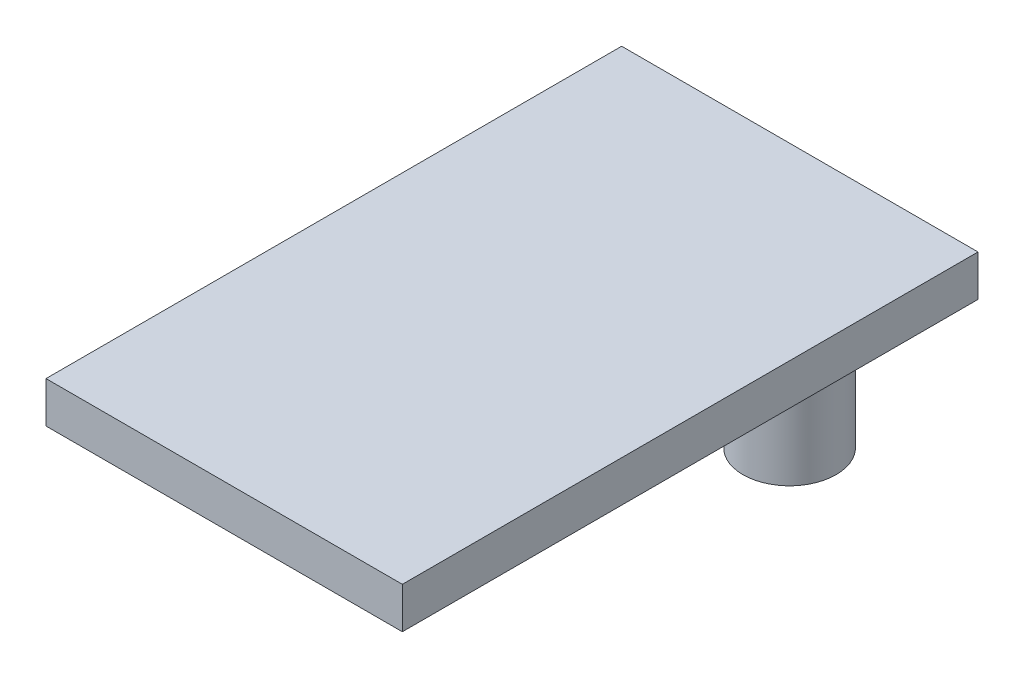
ISO-10303-21;
HEADER;
FILE_DESCRIPTION(('STEP AP214'),'2;1');
FILE_NAME('part.step','',(''),(''),'','','');
FILE_SCHEMA(('AUTOMOTIVE_DESIGN { 1 0 10303 214 1 1 1 1 }'));
ENDSEC;
DATA;
#1=APPLICATION_CONTEXT('core data for automotive mechanical design processes');
#2=APPLICATION_PROTOCOL_DEFINITION('international standard','automotive_design',2000,#1);
#3=PRODUCT_CONTEXT('',#1,'mechanical');
#4=PRODUCT('Part','Part','',(#3));
#5=PRODUCT_RELATED_PRODUCT_CATEGORY('part','',(#4));
#6=PRODUCT_DEFINITION_FORMATION('','',#4);
#7=PRODUCT_DEFINITION_CONTEXT('part definition',#1,'design');
#8=PRODUCT_DEFINITION('design','',#6,#7);
#9=PRODUCT_DEFINITION_SHAPE('','',#8);
#10=(LENGTH_UNIT() NAMED_UNIT(*) SI_UNIT(.MILLI.,.METRE.));
#11=(NAMED_UNIT(*) PLANE_ANGLE_UNIT() SI_UNIT($,.RADIAN.));
#12=(NAMED_UNIT(*) SI_UNIT($,.STERADIAN.) SOLID_ANGLE_UNIT());
#13=UNCERTAINTY_MEASURE_WITH_UNIT(LENGTH_MEASURE(1.E-05),#10,'distance_accuracy_value','');
#14=(GEOMETRIC_REPRESENTATION_CONTEXT(3) GLOBAL_UNCERTAINTY_ASSIGNED_CONTEXT((#13)) GLOBAL_UNIT_ASSIGNED_CONTEXT((#10,
#11,#12)) REPRESENTATION_CONTEXT('',''));
#15=CARTESIAN_POINT('',(0.,0.,0.));
#16=DIRECTION('',(0.,0.,1.));
#17=DIRECTION('',(1.,0.,0.));
#18=AXIS2_PLACEMENT_3D('',#15,#16,#17);
#19=CARTESIAN_POINT('',(-16.5753453748358,3.,24.8342932948844));
#20=DIRECTION('',(1.,0.,0.));
#21=DIRECTION('',(0.,0.,-1.));
#22=AXIS2_PLACEMENT_3D('',#19,#20,#21);
#23=PLANE('',#22);
#24=DIRECTION('',(0.,0.,1.));
#25=VECTOR('',#24,1.);
#26=CARTESIAN_POINT('',(-16.5753453748358,0.,24.8342932948844));
#27=LINE('',#26,#25);
#28=CARTESIAN_POINT('',(-16.5753453748358,0.,-17.1657067051156));
#29=VERTEX_POINT('',#28);
#30=CARTESIAN_POINT('',(-16.5753453748358,0.,24.8342932948844));
#31=VERTEX_POINT('',#30);
#32=EDGE_CURVE('E115',#29,#31,#27,.T.);
#33=ORIENTED_EDGE('',*,*,#32,.T.);
#34=DIRECTION('',(0.,-1.,0.));
#35=VECTOR('',#34,1.);
#36=CARTESIAN_POINT('',(-16.5753453748358,3.,24.8342932948844));
#37=LINE('',#36,#35);
#38=CARTESIAN_POINT('',(-16.5753453748358,3.,24.8342932948844));
#39=VERTEX_POINT('',#38);
#40=EDGE_CURVE('E104',#39,#31,#37,.T.);
#41=ORIENTED_EDGE('',*,*,#40,.F.);
#42=DIRECTION('',(0.,0.,1.));
#43=VECTOR('',#42,1.);
#44=CARTESIAN_POINT('',(-16.5753453748358,3.,24.8342932948844));
#45=LINE('',#44,#43);
#46=CARTESIAN_POINT('',(-16.5753453748358,3.,-17.1657067051156));
#47=VERTEX_POINT('',#46);
#48=EDGE_CURVE('E96',#47,#39,#45,.T.);
#49=ORIENTED_EDGE('',*,*,#48,.F.);
#50=DIRECTION('',(0.,-1.,0.));
#51=VECTOR('',#50,1.);
#52=CARTESIAN_POINT('',(-16.5753453748358,3.,-17.1657067051156));
#53=LINE('',#52,#51);
#54=EDGE_CURVE('E111',#47,#29,#53,.T.);
#55=ORIENTED_EDGE('',*,*,#54,.T.);
#56=EDGE_LOOP('',(#33,#41,#49,#55));
#57=FACE_BOUND('',#56,.T.);
#58=ADVANCED_FACE('F43',(#57),#23,.F.);
#59=CARTESIAN_POINT('',(9.42465462516425,3.,24.8342932948844));
#60=DIRECTION('',(0.,0.,-1.));
#61=DIRECTION('',(-1.,0.,0.));
#62=AXIS2_PLACEMENT_3D('',#59,#60,#61);
#63=PLANE('',#62);
#64=DIRECTION('',(1.,0.,0.));
#65=VECTOR('',#64,1.);
#66=CARTESIAN_POINT('',(9.42465462516425,0.,24.8342932948844));
#67=LINE('',#66,#65);
#68=CARTESIAN_POINT('',(9.42465462516425,0.,24.8342932948844));
#69=VERTEX_POINT('',#68);
#70=EDGE_CURVE('E102',#31,#69,#67,.T.);
#71=ORIENTED_EDGE('',*,*,#70,.T.);
#72=DIRECTION('',(0.,-1.,0.));
#73=VECTOR('',#72,1.);
#74=CARTESIAN_POINT('',(9.42465462516425,3.,24.8342932948844));
#75=LINE('',#74,#73);
#76=CARTESIAN_POINT('',(9.42465462516425,3.,24.8342932948844));
#77=VERTEX_POINT('',#76);
#78=EDGE_CURVE('E100',#77,#69,#75,.T.);
#79=ORIENTED_EDGE('',*,*,#78,.F.);
#80=DIRECTION('',(1.,0.,0.));
#81=VECTOR('',#80,1.);
#82=CARTESIAN_POINT('',(9.42465462516425,3.,24.8342932948844));
#83=LINE('',#82,#81);
#84=EDGE_CURVE('E91',#39,#77,#83,.T.);
#85=ORIENTED_EDGE('',*,*,#84,.F.);
#86=ORIENTED_EDGE('',*,*,#40,.T.);
#87=EDGE_LOOP('',(#71,#79,#85,#86));
#88=FACE_BOUND('',#87,.T.);
#89=ADVANCED_FACE('F101',(#88),#63,.F.);
#90=CARTESIAN_POINT('',(9.42465462516425,3.,24.8342932948844));
#91=DIRECTION('',(-1.,0.,0.));
#92=DIRECTION('',(0.,0.,1.));
#93=AXIS2_PLACEMENT_3D('',#90,#91,#92);
#94=PLANE('',#93);
#95=DIRECTION('',(0.,0.,-1.));
#96=VECTOR('',#95,1.);
#97=CARTESIAN_POINT('',(9.42465462516425,0.,24.8342932948844));
#98=LINE('',#97,#96);
#99=CARTESIAN_POINT('',(9.42465462516425,0.,-17.1657067051156));
#100=VERTEX_POINT('',#99);
#101=EDGE_CURVE('E77',#69,#100,#98,.T.);
#102=ORIENTED_EDGE('',*,*,#101,.T.);
#103=DIRECTION('',(0.,-1.,0.));
#104=VECTOR('',#103,1.);
#105=CARTESIAN_POINT('',(9.42465462516425,3.,-17.1657067051156));
#106=LINE('',#105,#104);
#107=CARTESIAN_POINT('',(9.42465462516425,3.,-17.1657067051156));
#108=VERTEX_POINT('',#107);
#109=EDGE_CURVE('E105',#108,#100,#106,.T.);
#110=ORIENTED_EDGE('',*,*,#109,.F.);
#111=DIRECTION('',(0.,0.,-1.));
#112=VECTOR('',#111,1.);
#113=CARTESIAN_POINT('',(9.42465462516425,3.,24.8342932948844));
#114=LINE('',#113,#112);
#115=EDGE_CURVE('E94',#77,#108,#114,.T.);
#116=ORIENTED_EDGE('',*,*,#115,.F.);
#117=ORIENTED_EDGE('',*,*,#78,.T.);
#118=EDGE_LOOP('',(#102,#110,#116,#117));
#119=FACE_BOUND('',#118,.T.);
#120=ADVANCED_FACE('F107',(#119),#94,.F.);
#121=CARTESIAN_POINT('',(9.42465462516425,3.,-17.1657067051156));
#122=DIRECTION('',(0.,0.,1.));
#123=DIRECTION('',(1.,0.,0.));
#124=AXIS2_PLACEMENT_3D('',#121,#122,#123);
#125=PLANE('',#124);
#126=DIRECTION('',(-1.,0.,0.));
#127=VECTOR('',#126,1.);
#128=CARTESIAN_POINT('',(9.42465462516425,0.,-17.1657067051156));
#129=LINE('',#128,#127);
#130=EDGE_CURVE('E83',#100,#29,#129,.T.);
#131=ORIENTED_EDGE('',*,*,#130,.T.);
#132=ORIENTED_EDGE('',*,*,#54,.F.);
#133=DIRECTION('',(-1.,0.,0.));
#134=VECTOR('',#133,1.);
#135=CARTESIAN_POINT('',(9.42465462516425,3.,-17.1657067051156));
#136=LINE('',#135,#134);
#137=EDGE_CURVE('E60',#108,#47,#136,.T.);
#138=ORIENTED_EDGE('',*,*,#137,.F.);
#139=ORIENTED_EDGE('',*,*,#109,.T.);
#140=EDGE_LOOP('',(#131,#132,#138,#139));
#141=FACE_BOUND('',#140,.T.);
#142=ADVANCED_FACE('F147',(#141),#125,.F.);
#143=CARTESIAN_POINT('',(0.,3.,0.));
#144=DIRECTION('',(0.,1.,0.));
#145=DIRECTION('',(0.,0.,1.));
#146=AXIS2_PLACEMENT_3D('',#143,#144,#145);
#147=PLANE('',#146);
#148=ORIENTED_EDGE('',*,*,#48,.T.);
#149=ORIENTED_EDGE('',*,*,#84,.T.);
#150=ORIENTED_EDGE('',*,*,#115,.T.);
#151=ORIENTED_EDGE('',*,*,#137,.T.);
#152=EDGE_LOOP('',(#148,#149,#150,#151));
#153=FACE_BOUND('',#152,.T.);
#154=ADVANCED_FACE('F92',(#153),#147,.T.);
#155=CARTESIAN_POINT('',(0.,0.,0.));
#156=DIRECTION('',(0.,1.,0.));
#157=DIRECTION('',(0.,0.,1.));
#158=AXIS2_PLACEMENT_3D('',#155,#156,#157);
#159=PLANE('',#158);
#160=CARTESIAN_POINT('',(2.92465462516428,0.,-9.91570670511555));
#161=DIRECTION('',(0.,1.,0.));
#162=DIRECTION('',(0.,0.,1.));
#163=AXIS2_PLACEMENT_3D('',#160,#161,#162);
#164=CIRCLE('',#163,3.4);
#165=CARTESIAN_POINT('',(2.92465462516428,0.,-6.51570670511555));
#166=VERTEX_POINT('',#165);
#167=EDGE_CURVE('E11',#166,#166,#164,.F.);
#168=ORIENTED_EDGE('',*,*,#167,.F.);
#169=EDGE_LOOP('',(#168));
#170=FACE_BOUND('',#169,.T.);
#171=CARTESIAN_POINT('',(-6.82534537483573,0.,7.83429329488446));
#172=DIRECTION('',(0.,1.,0.));
#173=DIRECTION('',(0.,0.,1.));
#174=AXIS2_PLACEMENT_3D('',#171,#172,#173);
#175=CIRCLE('',#174,3.4);
#176=CARTESIAN_POINT('',(-6.82534537483573,0.,11.2342932948845));
#177=VERTEX_POINT('',#176);
#178=EDGE_CURVE('E52',#177,#177,#175,.F.);
#179=ORIENTED_EDGE('',*,*,#178,.F.);
#180=EDGE_LOOP('',(#179));
#181=FACE_BOUND('',#180,.T.);
#182=ORIENTED_EDGE('',*,*,#32,.F.);
#183=ORIENTED_EDGE('',*,*,#130,.F.);
#184=ORIENTED_EDGE('',*,*,#101,.F.);
#185=ORIENTED_EDGE('',*,*,#70,.F.);
#186=EDGE_LOOP('',(#182,#183,#184,#185));
#187=FACE_BOUND('',#186,.T.);
#188=ADVANCED_FACE('F137',(#170,#181,#187),#159,.F.);
#189=CARTESIAN_POINT('',(-6.82534537483573,-9.,7.83429329488446));
#190=DIRECTION('',(0.,-1.,0.));
#191=DIRECTION('',(0.,0.,-1.));
#192=AXIS2_PLACEMENT_3D('',#189,#190,#191);
#193=PLANE('',#192);
#194=CARTESIAN_POINT('',(-6.82534537483573,-9.,7.83429329488446));
#195=DIRECTION('',(0.,-1.,0.));
#196=DIRECTION('',(0.,0.,-1.));
#197=AXIS2_PLACEMENT_3D('',#194,#195,#196);
#198=CIRCLE('',#197,3.4);
#199=CARTESIAN_POINT('',(-6.82534537483573,-9.,4.43429329488446));
#200=VERTEX_POINT('',#199);
#201=EDGE_CURVE('E119',#200,#200,#198,.T.);
#202=ORIENTED_EDGE('',*,*,#201,.T.);
#203=EDGE_LOOP('',(#202));
#204=FACE_BOUND('',#203,.T.);
#205=CARTESIAN_POINT('',(-6.82534537483573,-9.,7.83429329488446));
#206=DIRECTION('',(0.,-1.,0.));
#207=DIRECTION('',(0.,0.,-1.));
#208=AXIS2_PLACEMENT_3D('',#205,#206,#207);
#209=CIRCLE('',#208,1.9);
#210=CARTESIAN_POINT('',(-6.82534537483573,-9.,5.93429329488446));
#211=VERTEX_POINT('',#210);
#212=EDGE_CURVE('E291',#211,#211,#209,.T.);
#213=ORIENTED_EDGE('',*,*,#212,.F.);
#214=EDGE_LOOP('',(#213));
#215=FACE_BOUND('',#214,.T.);
#216=ADVANCED_FACE('F140',(#204,#215),#193,.T.);
#217=CARTESIAN_POINT('',(-6.82534537483573,-9.,7.83429329488446));
#218=DIRECTION('',(0.,1.,0.));
#219=DIRECTION('',(0.,0.,1.));
#220=AXIS2_PLACEMENT_3D('',#217,#218,#219);
#221=CYLINDRICAL_SURFACE('',#220,3.4);
#222=ORIENTED_EDGE('',*,*,#201,.F.);
#223=EDGE_LOOP('',(#222));
#224=FACE_BOUND('',#223,.T.);
#225=ORIENTED_EDGE('',*,*,#178,.T.);
#226=EDGE_LOOP('',(#225));
#227=FACE_BOUND('',#226,.T.);
#228=ADVANCED_FACE('F135',(#224,#227),#221,.T.);
#229=CARTESIAN_POINT('',(-6.82534537483573,-9.,7.83429329488446));
#230=DIRECTION('',(0.,1.,0.));
#231=DIRECTION('',(0.,0.,1.));
#232=AXIS2_PLACEMENT_3D('',#229,#230,#231);
#233=CYLINDRICAL_SURFACE('',#232,1.9);
#234=ORIENTED_EDGE('',*,*,#212,.T.);
#235=EDGE_LOOP('',(#234));
#236=FACE_BOUND('',#235,.T.);
#237=CARTESIAN_POINT('',(-6.82534537483573,0.,7.83429329488446));
#238=DIRECTION('',(0.,-1.,0.));
#239=DIRECTION('',(0.,0.,-1.));
#240=AXIS2_PLACEMENT_3D('',#237,#238,#239);
#241=CIRCLE('',#240,1.9);
#242=CARTESIAN_POINT('',(-6.82534537483573,0.,5.93429329488446));
#243=VERTEX_POINT('',#242);
#244=EDGE_CURVE('E285',#243,#243,#241,.T.);
#245=ORIENTED_EDGE('',*,*,#244,.F.);
#246=EDGE_LOOP('',(#245));
#247=FACE_BOUND('',#246,.T.);
#248=ADVANCED_FACE('F207',(#236,#247),#233,.F.);
#249=ORIENTED_EDGE('',*,*,#244,.T.);
#250=EDGE_LOOP('',(#249));
#251=FACE_BOUND('',#250,.T.);
#252=ADVANCED_FACE('F144',(#251),#159,.F.);
#253=CARTESIAN_POINT('',(2.92465462516428,-9.,-9.91570670511555));
#254=DIRECTION('',(0.,-1.,0.));
#255=DIRECTION('',(0.,0.,-1.));
#256=AXIS2_PLACEMENT_3D('',#253,#254,#255);
#257=PLANE('',#256);
#258=CARTESIAN_POINT('',(2.92465462516428,-9.,-9.91570670511555));
#259=DIRECTION('',(0.,-1.,0.));
#260=DIRECTION('',(0.,0.,-1.));
#261=AXIS2_PLACEMENT_3D('',#258,#259,#260);
#262=CIRCLE('',#261,3.4);
#263=CARTESIAN_POINT('',(2.92465462516428,-9.,-13.3157067051155));
#264=VERTEX_POINT('',#263);
#265=EDGE_CURVE('E294',#264,#264,#262,.T.);
#266=ORIENTED_EDGE('',*,*,#265,.T.);
#267=EDGE_LOOP('',(#266));
#268=FACE_BOUND('',#267,.T.);
#269=CARTESIAN_POINT('',(2.92465462516428,-9.,-9.91570670511555));
#270=DIRECTION('',(0.,-1.,0.));
#271=DIRECTION('',(0.,0.,-1.));
#272=AXIS2_PLACEMENT_3D('',#269,#270,#271);
#273=CIRCLE('',#272,1.9);
#274=CARTESIAN_POINT('',(2.92465462516428,-9.,-11.8157067051155));
#275=VERTEX_POINT('',#274);
#276=EDGE_CURVE('E286',#275,#275,#273,.T.);
#277=ORIENTED_EDGE('',*,*,#276,.F.);
#278=EDGE_LOOP('',(#277));
#279=FACE_BOUND('',#278,.T.);
#280=ADVANCED_FACE('F229',(#268,#279),#257,.T.);
#281=CARTESIAN_POINT('',(2.92465462516428,-9.,-9.91570670511555));
#282=DIRECTION('',(0.,1.,0.));
#283=DIRECTION('',(0.,0.,1.));
#284=AXIS2_PLACEMENT_3D('',#281,#282,#283);
#285=CYLINDRICAL_SURFACE('',#284,3.4);
#286=ORIENTED_EDGE('',*,*,#265,.F.);
#287=EDGE_LOOP('',(#286));
#288=FACE_BOUND('',#287,.T.);
#289=ORIENTED_EDGE('',*,*,#167,.T.);
#290=EDGE_LOOP('',(#289));
#291=FACE_BOUND('',#290,.T.);
#292=ADVANCED_FACE('F237',(#288,#291),#285,.T.);
#293=CARTESIAN_POINT('',(2.92465462516428,-9.,-9.91570670511555));
#294=DIRECTION('',(0.,1.,0.));
#295=DIRECTION('',(0.,0.,1.));
#296=AXIS2_PLACEMENT_3D('',#293,#294,#295);
#297=CYLINDRICAL_SURFACE('',#296,1.9);
#298=ORIENTED_EDGE('',*,*,#276,.T.);
#299=EDGE_LOOP('',(#298));
#300=FACE_BOUND('',#299,.T.);
#301=CARTESIAN_POINT('',(2.92465462516428,0.,-9.91570670511555));
#302=DIRECTION('',(0.,-1.,0.));
#303=DIRECTION('',(0.,0.,-1.));
#304=AXIS2_PLACEMENT_3D('',#301,#302,#303);
#305=CIRCLE('',#304,1.9);
#306=CARTESIAN_POINT('',(2.92465462516428,0.,-11.8157067051155));
#307=VERTEX_POINT('',#306);
#308=EDGE_CURVE('E282',#307,#307,#305,.T.);
#309=ORIENTED_EDGE('',*,*,#308,.F.);
#310=EDGE_LOOP('',(#309));
#311=FACE_BOUND('',#310,.T.);
#312=ADVANCED_FACE('F248',(#300,#311),#297,.F.);
#313=ORIENTED_EDGE('',*,*,#308,.T.);
#314=EDGE_LOOP('',(#313));
#315=FACE_BOUND('',#314,.T.);
#316=ADVANCED_FACE('F143',(#315),#159,.F.);
#317=CLOSED_SHELL('',(#58,#89,#120,#142,#154,#188,#216,#228,#248,#252,#280,#292,#312,#316));
#318=MANIFOLD_SOLID_BREP('B2',#317);
#319=ADVANCED_BREP_SHAPE_REPRESENTATION('',(#18,#318),#14);
#320=SHAPE_DEFINITION_REPRESENTATION(#9,#319);
ENDSEC;
END-ISO-10303-21;
